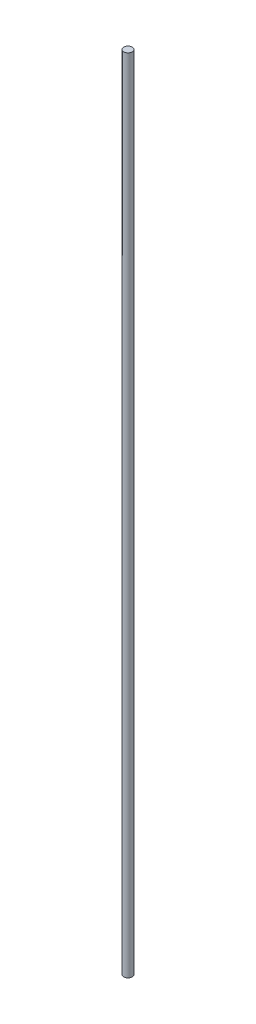
ISO-10303-21;
HEADER;
FILE_DESCRIPTION(('STEP AP214'),'2;1');
FILE_NAME('part.step','',(''),(''),'','','');
FILE_SCHEMA(('AUTOMOTIVE_DESIGN { 1 0 10303 214 1 1 1 1 }'));
ENDSEC;
DATA;
#1=APPLICATION_CONTEXT('core data for automotive mechanical design processes');
#2=APPLICATION_PROTOCOL_DEFINITION('international standard','automotive_design',2000,#1);
#3=PRODUCT_CONTEXT('',#1,'mechanical');
#4=PRODUCT('Part','Part','',(#3));
#5=PRODUCT_RELATED_PRODUCT_CATEGORY('part','',(#4));
#6=PRODUCT_DEFINITION_FORMATION('','',#4);
#7=PRODUCT_DEFINITION_CONTEXT('part definition',#1,'design');
#8=PRODUCT_DEFINITION('design','',#6,#7);
#9=PRODUCT_DEFINITION_SHAPE('','',#8);
#10=(LENGTH_UNIT() NAMED_UNIT(*) SI_UNIT(.MILLI.,.METRE.));
#11=(NAMED_UNIT(*) PLANE_ANGLE_UNIT() SI_UNIT($,.RADIAN.));
#12=(NAMED_UNIT(*) SI_UNIT($,.STERADIAN.) SOLID_ANGLE_UNIT());
#13=UNCERTAINTY_MEASURE_WITH_UNIT(LENGTH_MEASURE(1.E-05),#10,'distance_accuracy_value','');
#14=(GEOMETRIC_REPRESENTATION_CONTEXT(3) GLOBAL_UNCERTAINTY_ASSIGNED_CONTEXT((#13)) GLOBAL_UNIT_ASSIGNED_CONTEXT((#10,
#11,#12)) REPRESENTATION_CONTEXT('',''));
#15=CARTESIAN_POINT('',(0.,0.,0.));
#16=DIRECTION('',(0.,0.,1.));
#17=DIRECTION('',(1.,0.,0.));
#18=AXIS2_PLACEMENT_3D('',#15,#16,#17);
#19=CARTESIAN_POINT('',(0.,285.,0.));
#20=DIRECTION('',(0.,-1.,0.));
#21=DIRECTION('',(0.,0.,-1.));
#22=AXIS2_PLACEMENT_3D('',#19,#20,#21);
#23=CYLINDRICAL_SURFACE('',#22,1.5);
#24=CARTESIAN_POINT('',(0.,285.,0.));
#25=DIRECTION('',(0.,1.,0.));
#26=DIRECTION('',(0.,0.,1.));
#27=AXIS2_PLACEMENT_3D('',#24,#25,#26);
#28=CIRCLE('',#27,1.5);
#29=CARTESIAN_POINT('',(0.,285.,1.5));
#30=VERTEX_POINT('',#29);
#31=EDGE_CURVE('E10',#30,#30,#28,.T.);
#32=ORIENTED_EDGE('',*,*,#31,.F.);
#33=EDGE_LOOP('',(#32));
#34=FACE_BOUND('',#33,.T.);
#35=CARTESIAN_POINT('',(0.,0.,0.));
#36=DIRECTION('',(0.,1.,0.));
#37=DIRECTION('',(0.,0.,1.));
#38=AXIS2_PLACEMENT_3D('',#35,#36,#37);
#39=CIRCLE('',#38,1.5);
#40=CARTESIAN_POINT('',(0.,0.,1.5));
#41=VERTEX_POINT('',#40);
#42=EDGE_CURVE('E43',#41,#41,#39,.T.);
#43=ORIENTED_EDGE('',*,*,#42,.T.);
#44=EDGE_LOOP('',(#43));
#45=FACE_BOUND('',#44,.T.);
#46=ADVANCED_FACE('F40',(#34,#45),#23,.T.);
#47=CARTESIAN_POINT('',(0.,285.,0.));
#48=DIRECTION('',(0.,1.,0.));
#49=DIRECTION('',(0.,0.,1.));
#50=AXIS2_PLACEMENT_3D('',#47,#48,#49);
#51=PLANE('',#50);
#52=ORIENTED_EDGE('',*,*,#31,.T.);
#53=EDGE_LOOP('',(#52));
#54=FACE_BOUND('',#53,.T.);
#55=ADVANCED_FACE('F55',(#54),#51,.T.);
#56=CARTESIAN_POINT('',(0.,0.,0.));
#57=DIRECTION('',(0.,1.,0.));
#58=DIRECTION('',(0.,0.,1.));
#59=AXIS2_PLACEMENT_3D('',#56,#57,#58);
#60=PLANE('',#59);
#61=ORIENTED_EDGE('',*,*,#42,.F.);
#62=EDGE_LOOP('',(#61));
#63=FACE_BOUND('',#62,.T.);
#64=ADVANCED_FACE('F53',(#63),#60,.F.);
#65=CLOSED_SHELL('',(#46,#55,#64));
#66=MANIFOLD_SOLID_BREP('B2',#65);
#67=ADVANCED_BREP_SHAPE_REPRESENTATION('',(#18,#66),#14);
#68=SHAPE_DEFINITION_REPRESENTATION(#9,#67);
ENDSEC;
END-ISO-10303-21;
